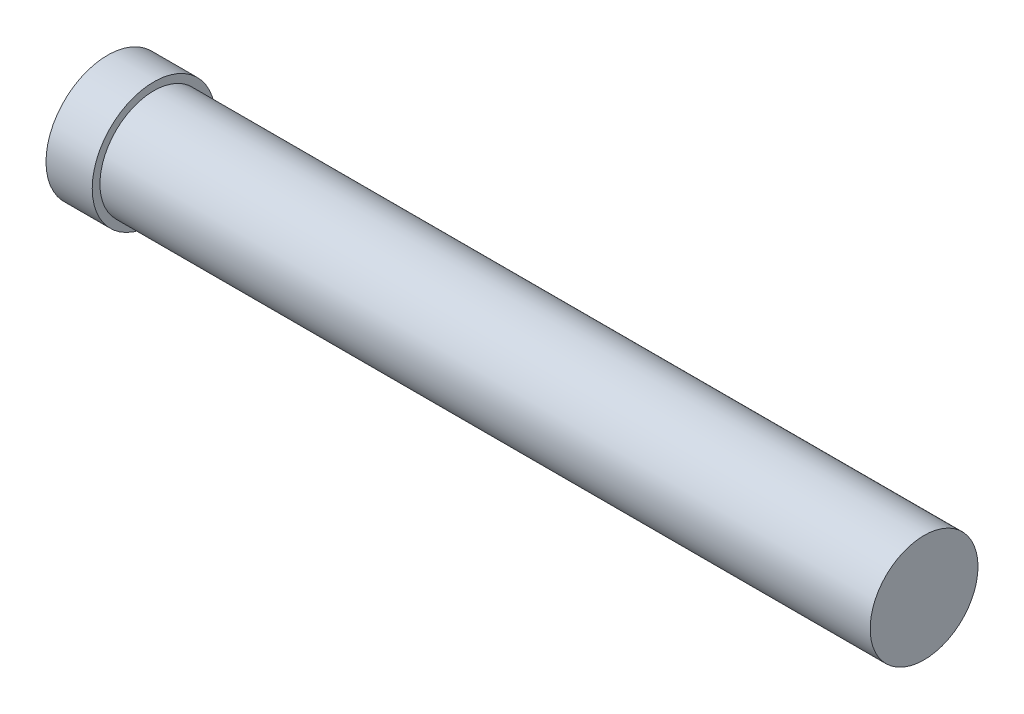
ISO-10303-21;
HEADER;
FILE_DESCRIPTION(('STEP AP214'),'2;1');
FILE_NAME('part.step','',(''),(''),'','','');
FILE_SCHEMA(('AUTOMOTIVE_DESIGN { 1 0 10303 214 1 1 1 1 }'));
ENDSEC;
DATA;
#1=APPLICATION_CONTEXT('core data for automotive mechanical design processes');
#2=APPLICATION_PROTOCOL_DEFINITION('international standard','automotive_design',2000,#1);
#3=PRODUCT_CONTEXT('',#1,'mechanical');
#4=PRODUCT('Part','Part','',(#3));
#5=PRODUCT_RELATED_PRODUCT_CATEGORY('part','',(#4));
#6=PRODUCT_DEFINITION_FORMATION('','',#4);
#7=PRODUCT_DEFINITION_CONTEXT('part definition',#1,'design');
#8=PRODUCT_DEFINITION('design','',#6,#7);
#9=PRODUCT_DEFINITION_SHAPE('','',#8);
#10=(LENGTH_UNIT() NAMED_UNIT(*) SI_UNIT(.MILLI.,.METRE.));
#11=(NAMED_UNIT(*) PLANE_ANGLE_UNIT() SI_UNIT($,.RADIAN.));
#12=(NAMED_UNIT(*) SI_UNIT($,.STERADIAN.) SOLID_ANGLE_UNIT());
#13=UNCERTAINTY_MEASURE_WITH_UNIT(LENGTH_MEASURE(1.E-05),#10,'distance_accuracy_value','');
#14=(GEOMETRIC_REPRESENTATION_CONTEXT(3) GLOBAL_UNCERTAINTY_ASSIGNED_CONTEXT((#13)) GLOBAL_UNIT_ASSIGNED_CONTEXT((#10,
#11,#12)) REPRESENTATION_CONTEXT('',''));
#15=CARTESIAN_POINT('',(0.,0.,0.));
#16=DIRECTION('',(0.,0.,1.));
#17=DIRECTION('',(1.,0.,0.));
#18=AXIS2_PLACEMENT_3D('',#15,#16,#17);
#19=CARTESIAN_POINT('',(50.,0.,0.));
#20=DIRECTION('',(-1.,0.,0.));
#21=DIRECTION('',(0.,0.,1.));
#22=AXIS2_PLACEMENT_3D('',#19,#20,#21);
#23=CYLINDRICAL_SURFACE('',#22,3.5);
#24=CARTESIAN_POINT('',(50.,0.,0.));
#25=DIRECTION('',(1.,0.,0.));
#26=DIRECTION('',(0.,0.,-1.));
#27=AXIS2_PLACEMENT_3D('',#24,#25,#26);
#28=CIRCLE('',#27,3.5);
#29=CARTESIAN_POINT('',(50.,0.,-3.5));
#30=VERTEX_POINT('',#29);
#31=EDGE_CURVE('E10',#30,#30,#28,.T.);
#32=ORIENTED_EDGE('',*,*,#31,.F.);
#33=EDGE_LOOP('',(#32));
#34=FACE_BOUND('',#33,.T.);
#35=CARTESIAN_POINT('',(0.,0.,0.));
#36=DIRECTION('',(1.,0.,0.));
#37=DIRECTION('',(0.,0.,-1.));
#38=AXIS2_PLACEMENT_3D('',#35,#36,#37);
#39=CIRCLE('',#38,3.5);
#40=CARTESIAN_POINT('',(0.,0.,-3.5));
#41=VERTEX_POINT('',#40);
#42=EDGE_CURVE('E40',#41,#41,#39,.T.);
#43=ORIENTED_EDGE('',*,*,#42,.T.);
#44=EDGE_LOOP('',(#43));
#45=FACE_BOUND('',#44,.T.);
#46=ADVANCED_FACE('F37',(#34,#45),#23,.T.);
#47=CARTESIAN_POINT('',(50.,0.,0.));
#48=DIRECTION('',(1.,0.,0.));
#49=DIRECTION('',(0.,0.,-1.));
#50=AXIS2_PLACEMENT_3D('',#47,#48,#49);
#51=PLANE('',#50);
#52=ORIENTED_EDGE('',*,*,#31,.T.);
#53=EDGE_LOOP('',(#52));
#54=FACE_BOUND('',#53,.T.);
#55=ADVANCED_FACE('F64',(#54),#51,.T.);
#56=CARTESIAN_POINT('',(-3.,0.,0.));
#57=DIRECTION('',(1.,0.,0.));
#58=DIRECTION('',(0.,0.,-1.));
#59=AXIS2_PLACEMENT_3D('',#56,#57,#58);
#60=CYLINDRICAL_SURFACE('',#59,4.);
#61=CARTESIAN_POINT('',(-3.,0.,0.));
#62=DIRECTION('',(-1.,0.,0.));
#63=DIRECTION('',(0.,0.,1.));
#64=AXIS2_PLACEMENT_3D('',#61,#62,#63);
#65=CIRCLE('',#64,4.);
#66=CARTESIAN_POINT('',(-3.,0.,4.));
#67=VERTEX_POINT('',#66);
#68=EDGE_CURVE('E49',#67,#67,#65,.T.);
#69=ORIENTED_EDGE('',*,*,#68,.F.);
#70=EDGE_LOOP('',(#69));
#71=FACE_BOUND('',#70,.T.);
#72=CARTESIAN_POINT('',(0.,0.,0.));
#73=DIRECTION('',(-1.,0.,0.));
#74=DIRECTION('',(0.,0.,1.));
#75=AXIS2_PLACEMENT_3D('',#72,#73,#74);
#76=CIRCLE('',#75,4.);
#77=CARTESIAN_POINT('',(0.,0.,4.));
#78=VERTEX_POINT('',#77);
#79=EDGE_CURVE('E51',#78,#78,#76,.T.);
#80=ORIENTED_EDGE('',*,*,#79,.T.);
#81=EDGE_LOOP('',(#80));
#82=FACE_BOUND('',#81,.T.);
#83=ADVANCED_FACE('F61',(#71,#82),#60,.T.);
#84=CARTESIAN_POINT('',(-3.,0.,0.));
#85=DIRECTION('',(-1.,0.,0.));
#86=DIRECTION('',(0.,0.,1.));
#87=AXIS2_PLACEMENT_3D('',#84,#85,#86);
#88=PLANE('',#87);
#89=ORIENTED_EDGE('',*,*,#68,.T.);
#90=EDGE_LOOP('',(#89));
#91=FACE_BOUND('',#90,.T.);
#92=ADVANCED_FACE('F59',(#91),#88,.T.);
#93=CARTESIAN_POINT('',(0.,0.,0.));
#94=DIRECTION('',(-1.,0.,0.));
#95=DIRECTION('',(0.,0.,1.));
#96=AXIS2_PLACEMENT_3D('',#93,#94,#95);
#97=PLANE('',#96);
#98=ORIENTED_EDGE('',*,*,#42,.F.);
#99=EDGE_LOOP('',(#98));
#100=FACE_BOUND('',#99,.T.);
#101=ORIENTED_EDGE('',*,*,#79,.F.);
#102=EDGE_LOOP('',(#101));
#103=FACE_BOUND('',#102,.T.);
#104=ADVANCED_FACE('F68',(#100,#103),#97,.F.);
#105=CLOSED_SHELL('',(#46,#55,#83,#92,#104));
#106=MANIFOLD_SOLID_BREP('B2',#105);
#107=ADVANCED_BREP_SHAPE_REPRESENTATION('',(#18,#106),#14);
#108=SHAPE_DEFINITION_REPRESENTATION(#9,#107);
ENDSEC;
END-ISO-10303-21;
